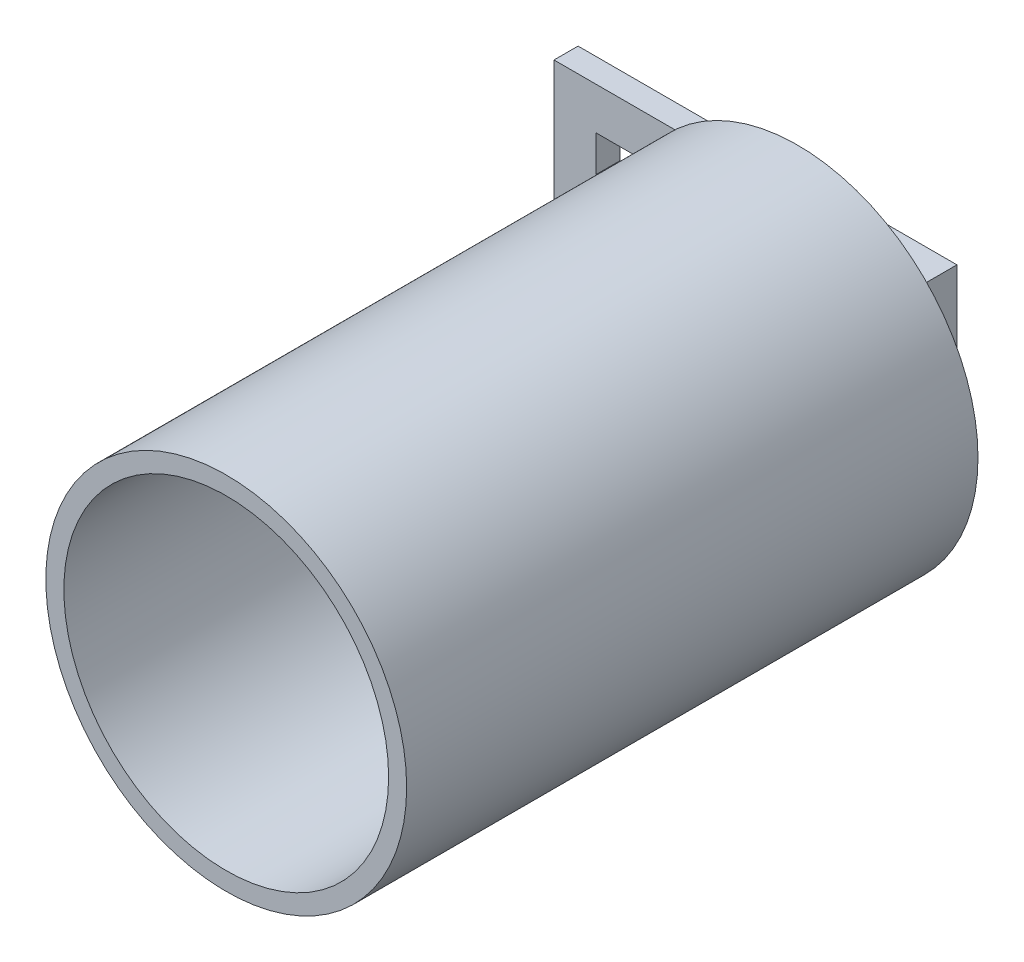
ISO-10303-21;
HEADER;
FILE_DESCRIPTION(('STEP AP214'),'2;1');
FILE_NAME('part.step','',(''),(''),'','','');
FILE_SCHEMA(('AUTOMOTIVE_DESIGN { 1 0 10303 214 1 1 1 1 }'));
ENDSEC;
DATA;
#1=APPLICATION_CONTEXT('core data for automotive mechanical design processes');
#2=APPLICATION_PROTOCOL_DEFINITION('international standard','automotive_design',2000,#1);
#3=PRODUCT_CONTEXT('',#1,'mechanical');
#4=PRODUCT('Part','Part','',(#3));
#5=PRODUCT_RELATED_PRODUCT_CATEGORY('part','',(#4));
#6=PRODUCT_DEFINITION_FORMATION('','',#4);
#7=PRODUCT_DEFINITION_CONTEXT('part definition',#1,'design');
#8=PRODUCT_DEFINITION('design','',#6,#7);
#9=PRODUCT_DEFINITION_SHAPE('','',#8);
#10=(LENGTH_UNIT() NAMED_UNIT(*) SI_UNIT(.MILLI.,.METRE.));
#11=(NAMED_UNIT(*) PLANE_ANGLE_UNIT() SI_UNIT($,.RADIAN.));
#12=(NAMED_UNIT(*) SI_UNIT($,.STERADIAN.) SOLID_ANGLE_UNIT());
#13=UNCERTAINTY_MEASURE_WITH_UNIT(LENGTH_MEASURE(1.E-05),#10,'distance_accuracy_value','');
#14=(GEOMETRIC_REPRESENTATION_CONTEXT(3) GLOBAL_UNCERTAINTY_ASSIGNED_CONTEXT((#13)) GLOBAL_UNIT_ASSIGNED_CONTEXT((#10,
#11,#12)) REPRESENTATION_CONTEXT('',''));
#15=CARTESIAN_POINT('',(0.,0.,0.));
#16=DIRECTION('',(0.,0.,1.));
#17=DIRECTION('',(1.,0.,0.));
#18=AXIS2_PLACEMENT_3D('',#15,#16,#17);
#19=CARTESIAN_POINT('',(-10.5,-10.,-16.));
#20=DIRECTION('',(1.,0.,0.));
#21=DIRECTION('',(0.,0.,-1.));
#22=AXIS2_PLACEMENT_3D('',#19,#20,#21);
#23=PLANE('',#22);
#24=DIRECTION('',(0.,1.,0.));
#25=VECTOR('',#24,1.);
#26=CARTESIAN_POINT('',(-10.5,10.,-12.));
#27=LINE('',#26,#25);
#28=CARTESIAN_POINT('',(-10.5,-10.,-12.));
#29=VERTEX_POINT('',#28);
#30=CARTESIAN_POINT('',(-10.5,10.,-12.));
#31=VERTEX_POINT('',#30);
#32=EDGE_CURVE('E124',#29,#31,#27,.T.);
#33=ORIENTED_EDGE('',*,*,#32,.F.);
#34=DIRECTION('',(0.,0.,1.));
#35=VECTOR('',#34,1.);
#36=CARTESIAN_POINT('',(-10.5,-10.,-16.));
#37=LINE('',#36,#35);
#38=CARTESIAN_POINT('',(-10.5,-10.,0.));
#39=VERTEX_POINT('',#38);
#40=EDGE_CURVE('E172',#29,#39,#37,.T.);
#41=ORIENTED_EDGE('',*,*,#40,.T.);
#42=DIRECTION('',(0.,1.,0.));
#43=VECTOR('',#42,1.);
#44=CARTESIAN_POINT('',(-10.5,-10.,0.));
#45=LINE('',#44,#43);
#46=CARTESIAN_POINT('',(-10.5,10.,0.));
#47=VERTEX_POINT('',#46);
#48=EDGE_CURVE('E164',#39,#47,#45,.T.);
#49=ORIENTED_EDGE('',*,*,#48,.T.);
#50=DIRECTION('',(0.,0.,1.));
#51=VECTOR('',#50,1.);
#52=CARTESIAN_POINT('',(-10.5,10.,-16.));
#53=LINE('',#52,#51);
#54=EDGE_CURVE('E190',#31,#47,#53,.T.);
#55=ORIENTED_EDGE('',*,*,#54,.F.);
#56=EDGE_LOOP('',(#33,#41,#49,#55));
#57=FACE_BOUND('',#56,.T.);
#58=ADVANCED_FACE('F33',(#57),#23,.F.);
#59=CARTESIAN_POINT('',(0.,0.,0.));
#60=DIRECTION('',(0.,0.,1.));
#61=DIRECTION('',(1.,0.,0.));
#62=AXIS2_PLACEMENT_3D('',#59,#60,#61);
#63=PLANE('',#62);
#64=CARTESIAN_POINT('',(0.,0.,0.));
#65=DIRECTION('',(0.,0.,1.));
#66=DIRECTION('',(1.,0.,0.));
#67=AXIS2_PLACEMENT_3D('',#64,#65,#66);
#68=CIRCLE('',#67,30.);
#69=CARTESIAN_POINT('',(30.,0.,0.));
#70=VERTEX_POINT('',#69);
#71=EDGE_CURVE('E37',#70,#70,#68,.T.);
#72=ORIENTED_EDGE('',*,*,#71,.F.);
#73=EDGE_LOOP('',(#72));
#74=FACE_BOUND('',#73,.T.);
#75=ORIENTED_EDGE('',*,*,#48,.F.);
#76=DIRECTION('',(-1.,0.,0.));
#77=VECTOR('',#76,1.);
#78=CARTESIAN_POINT('',(10.5,-10.,0.));
#79=LINE('',#78,#77);
#80=CARTESIAN_POINT('',(10.5,-10.,0.));
#81=VERTEX_POINT('',#80);
#82=EDGE_CURVE('E168',#81,#39,#79,.T.);
#83=ORIENTED_EDGE('',*,*,#82,.F.);
#84=DIRECTION('',(0.,-1.,0.));
#85=VECTOR('',#84,1.);
#86=CARTESIAN_POINT('',(10.5,-10.,0.));
#87=LINE('',#86,#85);
#88=CARTESIAN_POINT('',(10.5,10.,0.));
#89=VERTEX_POINT('',#88);
#90=EDGE_CURVE('E178',#89,#81,#87,.T.);
#91=ORIENTED_EDGE('',*,*,#90,.F.);
#92=DIRECTION('',(1.,0.,0.));
#93=VECTOR('',#92,1.);
#94=CARTESIAN_POINT('',(10.5,10.,0.));
#95=LINE('',#94,#93);
#96=EDGE_CURVE('E175',#47,#89,#95,.T.);
#97=ORIENTED_EDGE('',*,*,#96,.F.);
#98=EDGE_LOOP('',(#75,#83,#91,#97));
#99=FACE_BOUND('',#98,.T.);
#100=ADVANCED_FACE('F209',(#74,#99),#63,.F.);
#101=CARTESIAN_POINT('',(0.,0.,95.));
#102=DIRECTION('',(0.,0.,-1.));
#103=DIRECTION('',(-1.,0.,0.));
#104=AXIS2_PLACEMENT_3D('',#101,#102,#103);
#105=CYLINDRICAL_SURFACE('',#104,30.);
#106=CARTESIAN_POINT('',(0.,0.,95.));
#107=DIRECTION('',(0.,0.,1.));
#108=DIRECTION('',(1.,0.,0.));
#109=AXIS2_PLACEMENT_3D('',#106,#107,#108);
#110=CIRCLE('',#109,30.);
#111=CARTESIAN_POINT('',(30.,0.,95.));
#112=VERTEX_POINT('',#111);
#113=EDGE_CURVE('E11',#112,#112,#110,.T.);
#114=ORIENTED_EDGE('',*,*,#113,.F.);
#115=EDGE_LOOP('',(#114));
#116=FACE_BOUND('',#115,.T.);
#117=ORIENTED_EDGE('',*,*,#71,.T.);
#118=EDGE_LOOP('',(#117));
#119=FACE_BOUND('',#118,.T.);
#120=ADVANCED_FACE('F35',(#116,#119),#105,.T.);
#121=CARTESIAN_POINT('',(0.,0.,95.));
#122=DIRECTION('',(0.,0.,1.));
#123=DIRECTION('',(1.,0.,0.));
#124=AXIS2_PLACEMENT_3D('',#121,#122,#123);
#125=PLANE('',#124);
#126=CARTESIAN_POINT('',(0.,0.,95.));
#127=DIRECTION('',(0.,0.,1.));
#128=DIRECTION('',(1.,0.,0.));
#129=AXIS2_PLACEMENT_3D('',#126,#127,#128);
#130=CIRCLE('',#129,27.);
#131=CARTESIAN_POINT('',(27.,0.,95.));
#132=VERTEX_POINT('',#131);
#133=EDGE_CURVE('E192',#132,#132,#130,.T.);
#134=ORIENTED_EDGE('',*,*,#133,.F.);
#135=EDGE_LOOP('',(#134));
#136=FACE_BOUND('',#135,.T.);
#137=ORIENTED_EDGE('',*,*,#113,.T.);
#138=EDGE_LOOP('',(#137));
#139=FACE_BOUND('',#138,.T.);
#140=ADVANCED_FACE('F201',(#136,#139),#125,.T.);
#141=CARTESIAN_POINT('',(0.,0.,15.));
#142=DIRECTION('',(0.,0.,1.));
#143=DIRECTION('',(1.,0.,0.));
#144=AXIS2_PLACEMENT_3D('',#141,#142,#143);
#145=CYLINDRICAL_SURFACE('',#144,27.);
#146=CARTESIAN_POINT('',(0.,0.,15.));
#147=DIRECTION('',(0.,0.,1.));
#148=DIRECTION('',(1.,0.,0.));
#149=AXIS2_PLACEMENT_3D('',#146,#147,#148);
#150=CIRCLE('',#149,27.);
#151=CARTESIAN_POINT('',(27.,0.,15.));
#152=VERTEX_POINT('',#151);
#153=EDGE_CURVE('E193',#152,#152,#150,.T.);
#154=ORIENTED_EDGE('',*,*,#153,.F.);
#155=EDGE_LOOP('',(#154));
#156=FACE_BOUND('',#155,.T.);
#157=ORIENTED_EDGE('',*,*,#133,.T.);
#158=EDGE_LOOP('',(#157));
#159=FACE_BOUND('',#158,.T.);
#160=ADVANCED_FACE('F199',(#156,#159),#145,.F.);
#161=CARTESIAN_POINT('',(0.,0.,15.));
#162=DIRECTION('',(0.,0.,1.));
#163=DIRECTION('',(1.,0.,0.));
#164=AXIS2_PLACEMENT_3D('',#161,#162,#163);
#165=PLANE('',#164);
#166=ORIENTED_EDGE('',*,*,#153,.T.);
#167=EDGE_LOOP('',(#166));
#168=FACE_BOUND('',#167,.T.);
#169=ADVANCED_FACE('F256',(#168),#165,.T.);
#170=CARTESIAN_POINT('',(10.5,10.,-16.));
#171=DIRECTION('',(0.,-1.,0.));
#172=DIRECTION('',(0.,0.,-1.));
#173=AXIS2_PLACEMENT_3D('',#170,#171,#172);
#174=PLANE('',#173);
#175=ORIENTED_EDGE('',*,*,#96,.T.);
#176=DIRECTION('',(0.,0.,1.));
#177=VECTOR('',#176,1.);
#178=CARTESIAN_POINT('',(10.5,10.,-16.));
#179=LINE('',#178,#177);
#180=CARTESIAN_POINT('',(10.5,10.,-16.));
#181=VERTEX_POINT('',#180);
#182=EDGE_CURVE('E187',#181,#89,#179,.T.);
#183=ORIENTED_EDGE('',*,*,#182,.F.);
#184=DIRECTION('',(1.,0.,0.));
#185=VECTOR('',#184,1.);
#186=CARTESIAN_POINT('',(10.5,10.,-16.));
#187=LINE('',#186,#185);
#188=CARTESIAN_POINT('',(-52.5,10.,-16.));
#189=VERTEX_POINT('',#188);
#190=EDGE_CURVE('E165',#189,#181,#187,.T.);
#191=ORIENTED_EDGE('',*,*,#190,.F.);
#192=DIRECTION('',(0.,0.,-1.));
#193=VECTOR('',#192,1.);
#194=CARTESIAN_POINT('',(-52.5,10.,-16.));
#195=LINE('',#194,#193);
#196=CARTESIAN_POINT('',(-52.5,10.,-12.));
#197=VERTEX_POINT('',#196);
#198=EDGE_CURVE('E150',#197,#189,#195,.T.);
#199=ORIENTED_EDGE('',*,*,#198,.F.);
#200=DIRECTION('',(1.,0.,0.));
#201=VECTOR('',#200,1.);
#202=CARTESIAN_POINT('',(-52.5,10.,-12.));
#203=LINE('',#202,#201);
#204=EDGE_CURVE('E162',#197,#31,#203,.T.);
#205=ORIENTED_EDGE('',*,*,#204,.T.);
#206=ORIENTED_EDGE('',*,*,#54,.T.);
#207=EDGE_LOOP('',(#175,#183,#191,#199,#205,#206));
#208=FACE_BOUND('',#207,.T.);
#209=ADVANCED_FACE('F231',(#208),#174,.F.);
#210=CARTESIAN_POINT('',(10.5,-10.,-16.));
#211=DIRECTION('',(-1.,0.,0.));
#212=DIRECTION('',(0.,0.,1.));
#213=AXIS2_PLACEMENT_3D('',#210,#211,#212);
#214=PLANE('',#213);
#215=ORIENTED_EDGE('',*,*,#90,.T.);
#216=DIRECTION('',(0.,0.,1.));
#217=VECTOR('',#216,1.);
#218=CARTESIAN_POINT('',(10.5,-10.,-16.));
#219=LINE('',#218,#217);
#220=CARTESIAN_POINT('',(10.5,-10.,-16.));
#221=VERTEX_POINT('',#220);
#222=EDGE_CURVE('E184',#221,#81,#219,.T.);
#223=ORIENTED_EDGE('',*,*,#222,.F.);
#224=DIRECTION('',(0.,-1.,0.));
#225=VECTOR('',#224,1.);
#226=CARTESIAN_POINT('',(10.5,-10.,-16.));
#227=LINE('',#226,#225);
#228=EDGE_CURVE('E167',#181,#221,#227,.T.);
#229=ORIENTED_EDGE('',*,*,#228,.F.);
#230=ORIENTED_EDGE('',*,*,#182,.T.);
#231=EDGE_LOOP('',(#215,#223,#229,#230));
#232=FACE_BOUND('',#231,.T.);
#233=ADVANCED_FACE('F228',(#232),#214,.F.);
#234=CARTESIAN_POINT('',(10.5,-10.,-16.));
#235=DIRECTION('',(0.,1.,0.));
#236=DIRECTION('',(0.,0.,1.));
#237=AXIS2_PLACEMENT_3D('',#234,#235,#236);
#238=PLANE('',#237);
#239=ORIENTED_EDGE('',*,*,#82,.T.);
#240=ORIENTED_EDGE('',*,*,#40,.F.);
#241=DIRECTION('',(1.,0.,0.));
#242=VECTOR('',#241,1.);
#243=CARTESIAN_POINT('',(-52.5,-10.,-12.));
#244=LINE('',#243,#242);
#245=CARTESIAN_POINT('',(-52.5,-10.,-12.));
#246=VERTEX_POINT('',#245);
#247=EDGE_CURVE('E158',#246,#29,#244,.T.);
#248=ORIENTED_EDGE('',*,*,#247,.F.);
#249=DIRECTION('',(0.,0.,1.));
#250=VECTOR('',#249,1.);
#251=CARTESIAN_POINT('',(-52.5,-10.,-16.));
#252=LINE('',#251,#250);
#253=CARTESIAN_POINT('',(-52.5,-10.,-16.));
#254=VERTEX_POINT('',#253);
#255=EDGE_CURVE('E156',#254,#246,#252,.T.);
#256=ORIENTED_EDGE('',*,*,#255,.F.);
#257=DIRECTION('',(-1.,0.,0.));
#258=VECTOR('',#257,1.);
#259=CARTESIAN_POINT('',(10.5,-10.,-16.));
#260=LINE('',#259,#258);
#261=EDGE_CURVE('E170',#221,#254,#260,.T.);
#262=ORIENTED_EDGE('',*,*,#261,.F.);
#263=ORIENTED_EDGE('',*,*,#222,.T.);
#264=EDGE_LOOP('',(#239,#240,#248,#256,#262,#263));
#265=FACE_BOUND('',#264,.T.);
#266=ADVANCED_FACE('F221',(#265),#238,.F.);
#267=CARTESIAN_POINT('',(0.,0.,-16.));
#268=DIRECTION('',(0.,0.,1.));
#269=DIRECTION('',(1.,0.,0.));
#270=AXIS2_PLACEMENT_3D('',#267,#268,#269);
#271=PLANE('',#270);
#272=DIRECTION('',(1.,0.,0.));
#273=VECTOR('',#272,1.);
#274=CARTESIAN_POINT('',(-35.5,3.,-16.));
#275=LINE('',#274,#273);
#276=CARTESIAN_POINT('',(-45.5,3.,-16.));
#277=VERTEX_POINT('',#276);
#278=CARTESIAN_POINT('',(-35.5,3.,-16.));
#279=VERTEX_POINT('',#278);
#280=EDGE_CURVE('E132',#277,#279,#275,.T.);
#281=ORIENTED_EDGE('',*,*,#280,.F.);
#282=DIRECTION('',(0.,1.,0.));
#283=VECTOR('',#282,1.);
#284=CARTESIAN_POINT('',(-45.5,-3.,-16.));
#285=LINE('',#284,#283);
#286=CARTESIAN_POINT('',(-45.5,-3.,-16.));
#287=VERTEX_POINT('',#286);
#288=EDGE_CURVE('E48',#287,#277,#285,.T.);
#289=ORIENTED_EDGE('',*,*,#288,.F.);
#290=DIRECTION('',(-1.,0.,0.));
#291=VECTOR('',#290,1.);
#292=CARTESIAN_POINT('',(-35.5,-3.,-16.));
#293=LINE('',#292,#291);
#294=CARTESIAN_POINT('',(-35.5,-3.,-16.));
#295=VERTEX_POINT('',#294);
#296=EDGE_CURVE('E118',#295,#287,#293,.T.);
#297=ORIENTED_EDGE('',*,*,#296,.F.);
#298=DIRECTION('',(0.,-1.,0.));
#299=VECTOR('',#298,1.);
#300=CARTESIAN_POINT('',(-35.5,-3.,-16.));
#301=LINE('',#300,#299);
#302=EDGE_CURVE('E138',#279,#295,#301,.T.);
#303=ORIENTED_EDGE('',*,*,#302,.F.);
#304=EDGE_LOOP('',(#281,#289,#297,#303));
#305=FACE_BOUND('',#304,.T.);
#306=ORIENTED_EDGE('',*,*,#261,.T.);
#307=DIRECTION('',(0.,-1.,0.));
#308=VECTOR('',#307,1.);
#309=CARTESIAN_POINT('',(-52.5,10.,-16.));
#310=LINE('',#309,#308);
#311=EDGE_CURVE('E153',#189,#254,#310,.T.);
#312=ORIENTED_EDGE('',*,*,#311,.F.);
#313=ORIENTED_EDGE('',*,*,#190,.T.);
#314=ORIENTED_EDGE('',*,*,#228,.T.);
#315=EDGE_LOOP('',(#306,#312,#313,#314));
#316=FACE_BOUND('',#315,.T.);
#317=ADVANCED_FACE('F239',(#305,#316),#271,.F.);
#318=CARTESIAN_POINT('',(-52.5,10.,-12.));
#319=DIRECTION('',(0.,0.,-1.));
#320=DIRECTION('',(0.,1.,0.));
#321=AXIS2_PLACEMENT_3D('',#318,#319,#320);
#322=PLANE('',#321);
#323=DIRECTION('',(1.,0.,0.));
#324=VECTOR('',#323,1.);
#325=CARTESIAN_POINT('',(-35.5,-3.,-12.));
#326=LINE('',#325,#324);
#327=CARTESIAN_POINT('',(-45.5,-3.,-12.));
#328=VERTEX_POINT('',#327);
#329=CARTESIAN_POINT('',(-35.5,-3.,-12.));
#330=VERTEX_POINT('',#329);
#331=EDGE_CURVE('E130',#328,#330,#326,.T.);
#332=ORIENTED_EDGE('',*,*,#331,.F.);
#333=DIRECTION('',(0.,-1.,0.));
#334=VECTOR('',#333,1.);
#335=CARTESIAN_POINT('',(-45.5,-3.00000000000002,-12.));
#336=LINE('',#335,#334);
#337=CARTESIAN_POINT('',(-45.5,3.,-12.));
#338=VERTEX_POINT('',#337);
#339=EDGE_CURVE('E112',#338,#328,#336,.T.);
#340=ORIENTED_EDGE('',*,*,#339,.F.);
#341=DIRECTION('',(-1.,0.,0.));
#342=VECTOR('',#341,1.);
#343=CARTESIAN_POINT('',(-35.5,3.,-12.));
#344=LINE('',#343,#342);
#345=CARTESIAN_POINT('',(-35.5,3.,-12.));
#346=VERTEX_POINT('',#345);
#347=EDGE_CURVE('E121',#346,#338,#344,.T.);
#348=ORIENTED_EDGE('',*,*,#347,.F.);
#349=DIRECTION('',(0.,1.,0.));
#350=VECTOR('',#349,1.);
#351=CARTESIAN_POINT('',(-35.5,-3.00000000000002,-12.));
#352=LINE('',#351,#350);
#353=EDGE_CURVE('E56',#330,#346,#352,.T.);
#354=ORIENTED_EDGE('',*,*,#353,.F.);
#355=EDGE_LOOP('',(#332,#340,#348,#354));
#356=FACE_BOUND('',#355,.T.);
#357=ORIENTED_EDGE('',*,*,#32,.T.);
#358=ORIENTED_EDGE('',*,*,#204,.F.);
#359=DIRECTION('',(0.,1.,0.));
#360=VECTOR('',#359,1.);
#361=CARTESIAN_POINT('',(-52.5,10.,-12.));
#362=LINE('',#361,#360);
#363=EDGE_CURVE('E147',#246,#197,#362,.T.);
#364=ORIENTED_EDGE('',*,*,#363,.F.);
#365=ORIENTED_EDGE('',*,*,#247,.T.);
#366=EDGE_LOOP('',(#357,#358,#364,#365));
#367=FACE_BOUND('',#366,.T.);
#368=ADVANCED_FACE('F127',(#356,#367),#322,.F.);
#369=CARTESIAN_POINT('',(-52.5,0.,0.));
#370=DIRECTION('',(-1.,0.,0.));
#371=DIRECTION('',(0.,0.,1.));
#372=AXIS2_PLACEMENT_3D('',#369,#370,#371);
#373=PLANE('',#372);
#374=ORIENTED_EDGE('',*,*,#363,.T.);
#375=ORIENTED_EDGE('',*,*,#198,.T.);
#376=ORIENTED_EDGE('',*,*,#311,.T.);
#377=ORIENTED_EDGE('',*,*,#255,.T.);
#378=EDGE_LOOP('',(#374,#375,#376,#377));
#379=FACE_BOUND('',#378,.T.);
#380=ADVANCED_FACE('F236',(#379),#373,.T.);
#381=CARTESIAN_POINT('',(-45.5,-3.,95.001));
#382=DIRECTION('',(-1.,0.,0.));
#383=DIRECTION('',(0.,0.,1.));
#384=AXIS2_PLACEMENT_3D('',#381,#382,#383);
#385=PLANE('',#384);
#386=ORIENTED_EDGE('',*,*,#339,.T.);
#387=DIRECTION('',(0.,0.,-1.));
#388=VECTOR('',#387,1.);
#389=CARTESIAN_POINT('',(-45.5,-3.,95.001));
#390=LINE('',#389,#388);
#391=EDGE_CURVE('E125',#328,#287,#390,.T.);
#392=ORIENTED_EDGE('',*,*,#391,.T.);
#393=ORIENTED_EDGE('',*,*,#288,.T.);
#394=DIRECTION('',(0.,0.,-1.));
#395=VECTOR('',#394,1.);
#396=CARTESIAN_POINT('',(-45.5,3.,95.001));
#397=LINE('',#396,#395);
#398=EDGE_CURVE('E108',#338,#277,#397,.T.);
#399=ORIENTED_EDGE('',*,*,#398,.F.);
#400=EDGE_LOOP('',(#386,#392,#393,#399));
#401=FACE_BOUND('',#400,.T.);
#402=ADVANCED_FACE('F110',(#401),#385,.F.);
#403=CARTESIAN_POINT('',(-35.5,-3.,95.001));
#404=DIRECTION('',(0.,-1.,0.));
#405=DIRECTION('',(0.,0.,-1.));
#406=AXIS2_PLACEMENT_3D('',#403,#404,#405);
#407=PLANE('',#406);
#408=ORIENTED_EDGE('',*,*,#331,.T.);
#409=DIRECTION('',(0.,0.,-1.));
#410=VECTOR('',#409,1.);
#411=CARTESIAN_POINT('',(-35.5,-3.,95.001));
#412=LINE('',#411,#410);
#413=EDGE_CURVE('E144',#330,#295,#412,.T.);
#414=ORIENTED_EDGE('',*,*,#413,.T.);
#415=ORIENTED_EDGE('',*,*,#296,.T.);
#416=ORIENTED_EDGE('',*,*,#391,.F.);
#417=EDGE_LOOP('',(#408,#414,#415,#416));
#418=FACE_BOUND('',#417,.T.);
#419=ADVANCED_FACE('F315',(#418),#407,.F.);
#420=CARTESIAN_POINT('',(-35.5,-3.,95.001));
#421=DIRECTION('',(1.,0.,0.));
#422=DIRECTION('',(0.,0.,-1.));
#423=AXIS2_PLACEMENT_3D('',#420,#421,#422);
#424=PLANE('',#423);
#425=ORIENTED_EDGE('',*,*,#353,.T.);
#426=DIRECTION('',(0.,0.,-1.));
#427=VECTOR('',#426,1.);
#428=CARTESIAN_POINT('',(-35.5,3.,95.001));
#429=LINE('',#428,#427);
#430=EDGE_CURVE('E117',#346,#279,#429,.T.);
#431=ORIENTED_EDGE('',*,*,#430,.T.);
#432=ORIENTED_EDGE('',*,*,#302,.T.);
#433=ORIENTED_EDGE('',*,*,#413,.F.);
#434=EDGE_LOOP('',(#425,#431,#432,#433));
#435=FACE_BOUND('',#434,.T.);
#436=ADVANCED_FACE('F324',(#435),#424,.F.);
#437=CARTESIAN_POINT('',(-35.5,3.,95.001));
#438=DIRECTION('',(0.,1.,0.));
#439=DIRECTION('',(0.,0.,1.));
#440=AXIS2_PLACEMENT_3D('',#437,#438,#439);
#441=PLANE('',#440);
#442=ORIENTED_EDGE('',*,*,#347,.T.);
#443=ORIENTED_EDGE('',*,*,#398,.T.);
#444=ORIENTED_EDGE('',*,*,#280,.T.);
#445=ORIENTED_EDGE('',*,*,#430,.F.);
#446=EDGE_LOOP('',(#442,#443,#444,#445));
#447=FACE_BOUND('',#446,.T.);
#448=ADVANCED_FACE('F122',(#447),#441,.F.);
#449=CLOSED_SHELL('',(#58,#100,#120,#140,#160,#169,#209,#233,#266,#317,#368,#380,#402,#419,#436,#448));
#450=MANIFOLD_SOLID_BREP('B2',#449);
#451=ADVANCED_BREP_SHAPE_REPRESENTATION('',(#18,#450),#14);
#452=SHAPE_DEFINITION_REPRESENTATION(#9,#451);
ENDSEC;
END-ISO-10303-21;
